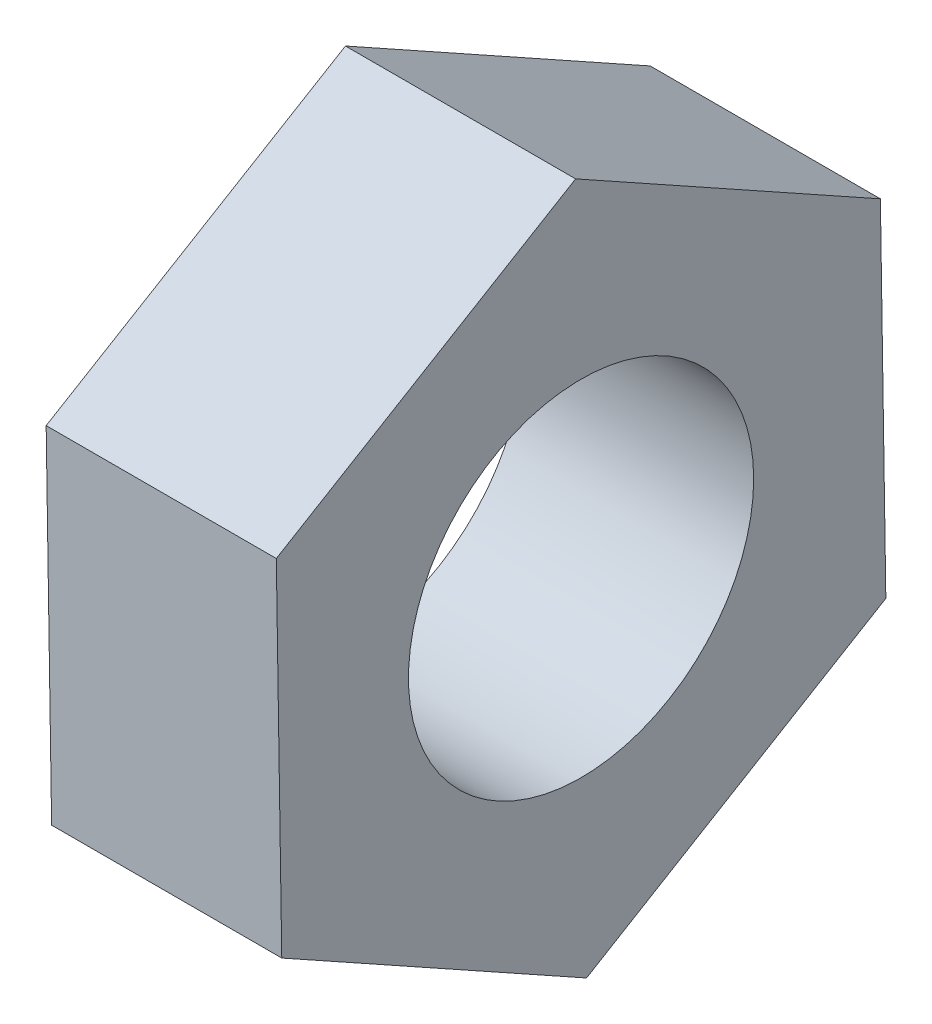
ISO-10303-21;
HEADER;
FILE_DESCRIPTION(('STEP AP214'),'2;1');
FILE_NAME('part.step','',(''),(''),'','','');
FILE_SCHEMA(('AUTOMOTIVE_DESIGN { 1 0 10303 214 1 1 1 1 }'));
ENDSEC;
DATA;
#1=APPLICATION_CONTEXT('core data for automotive mechanical design processes');
#2=APPLICATION_PROTOCOL_DEFINITION('international standard','automotive_design',2000,#1);
#3=PRODUCT_CONTEXT('',#1,'mechanical');
#4=PRODUCT('Part','Part','',(#3));
#5=PRODUCT_RELATED_PRODUCT_CATEGORY('part','',(#4));
#6=PRODUCT_DEFINITION_FORMATION('','',#4);
#7=PRODUCT_DEFINITION_CONTEXT('part definition',#1,'design');
#8=PRODUCT_DEFINITION('design','',#6,#7);
#9=PRODUCT_DEFINITION_SHAPE('','',#8);
#10=(LENGTH_UNIT() NAMED_UNIT(*) SI_UNIT(.MILLI.,.METRE.));
#11=(NAMED_UNIT(*) PLANE_ANGLE_UNIT() SI_UNIT($,.RADIAN.));
#12=(NAMED_UNIT(*) SI_UNIT($,.STERADIAN.) SOLID_ANGLE_UNIT());
#13=UNCERTAINTY_MEASURE_WITH_UNIT(LENGTH_MEASURE(1.E-05),#10,'distance_accuracy_value','');
#14=(GEOMETRIC_REPRESENTATION_CONTEXT(3) GLOBAL_UNCERTAINTY_ASSIGNED_CONTEXT((#13)) GLOBAL_UNIT_ASSIGNED_CONTEXT((#10,
#11,#12)) REPRESENTATION_CONTEXT('',''));
#15=CARTESIAN_POINT('',(0.,0.,0.));
#16=DIRECTION('',(0.,0.,1.));
#17=DIRECTION('',(1.,0.,0.));
#18=AXIS2_PLACEMENT_3D('',#15,#16,#17);
#19=CARTESIAN_POINT('',(8.,0.,0.));
#20=DIRECTION('',(1.,0.,0.));
#21=DIRECTION('',(0.,0.,-1.));
#22=AXIS2_PLACEMENT_3D('',#19,#20,#21);
#23=PLANE('',#22);
#24=DIRECTION('',(0.,0.513492900870808,-0.858093841462158));
#25=VECTOR('',#24,1.);
#26=CARTESIAN_POINT('',(8.,-12.1228706130722,-0.189758000383048));
#27=LINE('',#26,#25);
#28=CARTESIAN_POINT('',(8.,-12.1228706130722,-0.189758000383048));
#29=VERTEX_POINT('',#28);
#30=CARTESIAN_POINT('',(8.,-5.89710005763306,-10.5935929179039));
#31=VERTEX_POINT('',#30);
#32=EDGE_CURVE('E129',#29,#31,#27,.T.);
#33=ORIENTED_EDGE('',*,*,#32,.T.);
#34=DIRECTION('',(0.,0.999877515972609,0.0156509760860052));
#35=VECTOR('',#34,1.);
#36=CARTESIAN_POINT('',(8.,-5.89710005763306,-10.5935929179039));
#37=LINE('',#36,#35);
#38=CARTESIAN_POINT('',(8.,6.22577055543918,-10.4038349175209));
#39=VERTEX_POINT('',#38);
#40=EDGE_CURVE('E87',#31,#39,#37,.T.);
#41=ORIENTED_EDGE('',*,*,#40,.T.);
#42=DIRECTION('',(0.,0.486384615101801,0.873744817548163));
#43=VECTOR('',#42,1.);
#44=CARTESIAN_POINT('',(8.,6.22577055543918,-10.4038349175209));
#45=LINE('',#44,#43);
#46=CARTESIAN_POINT('',(8.,12.1228706130722,0.189758000383049));
#47=VERTEX_POINT('',#46);
#48=EDGE_CURVE('E100',#39,#47,#45,.T.);
#49=ORIENTED_EDGE('',*,*,#48,.T.);
#50=DIRECTION('',(0.,-0.513492900870808,0.858093841462157));
#51=VECTOR('',#50,1.);
#52=CARTESIAN_POINT('',(8.,12.1228706130722,0.189758000383049));
#53=LINE('',#52,#51);
#54=CARTESIAN_POINT('',(8.,5.89710005763306,10.5935929179039));
#55=VERTEX_POINT('',#54);
#56=EDGE_CURVE('E94',#47,#55,#53,.T.);
#57=ORIENTED_EDGE('',*,*,#56,.T.);
#58=DIRECTION('',(0.,-0.999877515972609,-0.0156509760860057));
#59=VECTOR('',#58,1.);
#60=CARTESIAN_POINT('',(8.,5.89710005763306,10.5935929179039));
#61=LINE('',#60,#59);
#62=CARTESIAN_POINT('',(8.,-6.22577055543918,10.4038349175209));
#63=VERTEX_POINT('',#62);
#64=EDGE_CURVE('E98',#55,#63,#61,.T.);
#65=ORIENTED_EDGE('',*,*,#64,.T.);
#66=DIRECTION('',(0.,-0.486384615101801,-0.873744817548163));
#67=VECTOR('',#66,1.);
#68=CARTESIAN_POINT('',(8.,-6.22577055543918,10.4038349175209));
#69=LINE('',#68,#67);
#70=EDGE_CURVE('E50',#63,#29,#69,.T.);
#71=ORIENTED_EDGE('',*,*,#70,.T.);
#72=EDGE_LOOP('',(#33,#41,#49,#57,#65,#71));
#73=FACE_BOUND('',#72,.T.);
#74=CARTESIAN_POINT('',(8.,0.,0.));
#75=DIRECTION('',(1.,0.,0.));
#76=DIRECTION('',(0.,0.,-1.));
#77=AXIS2_PLACEMENT_3D('',#74,#75,#76);
#78=CIRCLE('',#77,6.);
#79=CARTESIAN_POINT('',(8.,0.,-6.));
#80=VERTEX_POINT('',#79);
#81=EDGE_CURVE('E122',#80,#80,#78,.T.);
#82=ORIENTED_EDGE('',*,*,#81,.F.);
#83=EDGE_LOOP('',(#82));
#84=FACE_BOUND('',#83,.T.);
#85=ADVANCED_FACE('F33',(#73,#84),#23,.T.);
#86=CARTESIAN_POINT('',(0.,0.,0.));
#87=DIRECTION('',(1.,0.,0.));
#88=DIRECTION('',(0.,0.,-1.));
#89=AXIS2_PLACEMENT_3D('',#86,#87,#88);
#90=PLANE('',#89);
#91=DIRECTION('',(0.,0.513492900870808,-0.858093841462158));
#92=VECTOR('',#91,1.);
#93=CARTESIAN_POINT('',(0.,-12.1228706130722,-0.189758000383048));
#94=LINE('',#93,#92);
#95=CARTESIAN_POINT('',(0.,-12.1228706130722,-0.189758000383048));
#96=VERTEX_POINT('',#95);
#97=CARTESIAN_POINT('',(0.,-5.89710005763306,-10.5935929179039));
#98=VERTEX_POINT('',#97);
#99=EDGE_CURVE('E118',#96,#98,#94,.T.);
#100=ORIENTED_EDGE('',*,*,#99,.F.);
#101=DIRECTION('',(0.,-0.486384615101801,-0.873744817548163));
#102=VECTOR('',#101,1.);
#103=CARTESIAN_POINT('',(0.,-6.22577055543918,10.4038349175209));
#104=LINE('',#103,#102);
#105=CARTESIAN_POINT('',(0.,-6.22577055543918,10.4038349175209));
#106=VERTEX_POINT('',#105);
#107=EDGE_CURVE('E79',#106,#96,#104,.T.);
#108=ORIENTED_EDGE('',*,*,#107,.F.);
#109=DIRECTION('',(0.,-0.999877515972609,-0.0156509760860057));
#110=VECTOR('',#109,1.);
#111=CARTESIAN_POINT('',(0.,5.89710005763306,10.5935929179039));
#112=LINE('',#111,#110);
#113=CARTESIAN_POINT('',(0.,5.89710005763306,10.5935929179039));
#114=VERTEX_POINT('',#113);
#115=EDGE_CURVE('E73',#114,#106,#112,.T.);
#116=ORIENTED_EDGE('',*,*,#115,.F.);
#117=DIRECTION('',(0.,-0.513492900870808,0.858093841462157));
#118=VECTOR('',#117,1.);
#119=CARTESIAN_POINT('',(0.,12.1228706130722,0.189758000383049));
#120=LINE('',#119,#118);
#121=CARTESIAN_POINT('',(0.,12.1228706130722,0.189758000383049));
#122=VERTEX_POINT('',#121);
#123=EDGE_CURVE('E108',#122,#114,#120,.T.);
#124=ORIENTED_EDGE('',*,*,#123,.F.);
#125=DIRECTION('',(0.,0.486384615101801,0.873744817548163));
#126=VECTOR('',#125,1.);
#127=CARTESIAN_POINT('',(0.,6.22577055543918,-10.4038349175209));
#128=LINE('',#127,#126);
#129=CARTESIAN_POINT('',(0.,6.22577055543918,-10.4038349175209));
#130=VERTEX_POINT('',#129);
#131=EDGE_CURVE('E124',#130,#122,#128,.T.);
#132=ORIENTED_EDGE('',*,*,#131,.F.);
#133=DIRECTION('',(0.,0.999877515972609,0.0156509760860052));
#134=VECTOR('',#133,1.);
#135=CARTESIAN_POINT('',(0.,-5.89710005763306,-10.5935929179039));
#136=LINE('',#135,#134);
#137=EDGE_CURVE('E121',#98,#130,#136,.T.);
#138=ORIENTED_EDGE('',*,*,#137,.F.);
#139=EDGE_LOOP('',(#100,#108,#116,#124,#132,#138));
#140=FACE_BOUND('',#139,.T.);
#141=CARTESIAN_POINT('',(0.,0.,0.));
#142=DIRECTION('',(1.,0.,0.));
#143=DIRECTION('',(0.,0.,-1.));
#144=AXIS2_PLACEMENT_3D('',#141,#142,#143);
#145=CIRCLE('',#144,6.);
#146=CARTESIAN_POINT('',(0.,0.,-6.));
#147=VERTEX_POINT('',#146);
#148=EDGE_CURVE('E222',#147,#147,#145,.T.);
#149=ORIENTED_EDGE('',*,*,#148,.T.);
#150=EDGE_LOOP('',(#149));
#151=FACE_BOUND('',#150,.T.);
#152=ADVANCED_FACE('F138',(#140,#151),#90,.F.);
#153=CARTESIAN_POINT('',(8.,-12.1228706130722,-0.189758000383048));
#154=DIRECTION('',(0.,0.858093841462158,0.513492900870808));
#155=DIRECTION('',(0.,-0.513492900870808,0.858093841462158));
#156=AXIS2_PLACEMENT_3D('',#153,#154,#155);
#157=PLANE('',#156);
#158=ORIENTED_EDGE('',*,*,#99,.T.);
#159=DIRECTION('',(-1.,0.,0.));
#160=VECTOR('',#159,1.);
#161=CARTESIAN_POINT('',(8.,-5.89710005763306,-10.5935929179039));
#162=LINE('',#161,#160);
#163=EDGE_CURVE('E11',#31,#98,#162,.T.);
#164=ORIENTED_EDGE('',*,*,#163,.F.);
#165=ORIENTED_EDGE('',*,*,#32,.F.);
#166=DIRECTION('',(-1.,0.,0.));
#167=VECTOR('',#166,1.);
#168=CARTESIAN_POINT('',(8.,-12.1228706130722,-0.189758000383048));
#169=LINE('',#168,#167);
#170=EDGE_CURVE('E114',#29,#96,#169,.T.);
#171=ORIENTED_EDGE('',*,*,#170,.T.);
#172=EDGE_LOOP('',(#158,#164,#165,#171));
#173=FACE_BOUND('',#172,.T.);
#174=ADVANCED_FACE('F35',(#173),#157,.F.);
#175=CARTESIAN_POINT('',(8.,-5.89710005763306,-10.5935929179039));
#176=DIRECTION('',(0.,-0.0156509760860052,0.999877515972609));
#177=DIRECTION('',(0.,-0.999877515972609,-0.0156509760860052));
#178=AXIS2_PLACEMENT_3D('',#175,#176,#177);
#179=PLANE('',#178);
#180=ORIENTED_EDGE('',*,*,#137,.T.);
#181=DIRECTION('',(-1.,0.,0.));
#182=VECTOR('',#181,1.);
#183=CARTESIAN_POINT('',(8.,6.22577055543918,-10.4038349175209));
#184=LINE('',#183,#182);
#185=EDGE_CURVE('E42',#39,#130,#184,.T.);
#186=ORIENTED_EDGE('',*,*,#185,.F.);
#187=ORIENTED_EDGE('',*,*,#40,.F.);
#188=ORIENTED_EDGE('',*,*,#163,.T.);
#189=EDGE_LOOP('',(#180,#186,#187,#188));
#190=FACE_BOUND('',#189,.T.);
#191=ADVANCED_FACE('F163',(#190),#179,.F.);
#192=CARTESIAN_POINT('',(8.,6.22577055543918,-10.4038349175209));
#193=DIRECTION('',(0.,-0.873744817548163,0.486384615101801));
#194=DIRECTION('',(0.,-0.486384615101801,-0.873744817548163));
#195=AXIS2_PLACEMENT_3D('',#192,#193,#194);
#196=PLANE('',#195);
#197=ORIENTED_EDGE('',*,*,#131,.T.);
#198=DIRECTION('',(-1.,0.,0.));
#199=VECTOR('',#198,1.);
#200=CARTESIAN_POINT('',(8.,12.1228706130722,0.189758000383049));
#201=LINE('',#200,#199);
#202=EDGE_CURVE('E109',#47,#122,#201,.T.);
#203=ORIENTED_EDGE('',*,*,#202,.F.);
#204=ORIENTED_EDGE('',*,*,#48,.F.);
#205=ORIENTED_EDGE('',*,*,#185,.T.);
#206=EDGE_LOOP('',(#197,#203,#204,#205));
#207=FACE_BOUND('',#206,.T.);
#208=ADVANCED_FACE('F135',(#207),#196,.F.);
#209=CARTESIAN_POINT('',(8.,12.1228706130722,0.189758000383049));
#210=DIRECTION('',(0.,-0.858093841462158,-0.513492900870808));
#211=DIRECTION('',(0.,0.513492900870808,-0.858093841462158));
#212=AXIS2_PLACEMENT_3D('',#209,#210,#211);
#213=PLANE('',#212);
#214=ORIENTED_EDGE('',*,*,#123,.T.);
#215=DIRECTION('',(-1.,0.,0.));
#216=VECTOR('',#215,1.);
#217=CARTESIAN_POINT('',(8.,5.89710005763306,10.5935929179039));
#218=LINE('',#217,#216);
#219=EDGE_CURVE('E105',#55,#114,#218,.T.);
#220=ORIENTED_EDGE('',*,*,#219,.F.);
#221=ORIENTED_EDGE('',*,*,#56,.F.);
#222=ORIENTED_EDGE('',*,*,#202,.T.);
#223=EDGE_LOOP('',(#214,#220,#221,#222));
#224=FACE_BOUND('',#223,.T.);
#225=ADVANCED_FACE('F106',(#224),#213,.F.);
#226=CARTESIAN_POINT('',(8.,5.89710005763306,10.5935929179039));
#227=DIRECTION('',(0.,0.0156509760860057,-0.999877515972609));
#228=DIRECTION('',(0.,0.999877515972609,0.0156509760860057));
#229=AXIS2_PLACEMENT_3D('',#226,#227,#228);
#230=PLANE('',#229);
#231=ORIENTED_EDGE('',*,*,#115,.T.);
#232=DIRECTION('',(-1.,0.,0.));
#233=VECTOR('',#232,1.);
#234=CARTESIAN_POINT('',(8.,-6.22577055543918,10.4038349175209));
#235=LINE('',#234,#233);
#236=EDGE_CURVE('E110',#63,#106,#235,.T.);
#237=ORIENTED_EDGE('',*,*,#236,.F.);
#238=ORIENTED_EDGE('',*,*,#64,.F.);
#239=ORIENTED_EDGE('',*,*,#219,.T.);
#240=EDGE_LOOP('',(#231,#237,#238,#239));
#241=FACE_BOUND('',#240,.T.);
#242=ADVANCED_FACE('F112',(#241),#230,.F.);
#243=CARTESIAN_POINT('',(8.,-6.22577055543918,10.4038349175209));
#244=DIRECTION('',(0.,0.873744817548163,-0.486384615101801));
#245=DIRECTION('',(0.,0.486384615101801,0.873744817548163));
#246=AXIS2_PLACEMENT_3D('',#243,#244,#245);
#247=PLANE('',#246);
#248=ORIENTED_EDGE('',*,*,#107,.T.);
#249=ORIENTED_EDGE('',*,*,#170,.F.);
#250=ORIENTED_EDGE('',*,*,#70,.F.);
#251=ORIENTED_EDGE('',*,*,#236,.T.);
#252=EDGE_LOOP('',(#248,#249,#250,#251));
#253=FACE_BOUND('',#252,.T.);
#254=ADVANCED_FACE('F143',(#253),#247,.F.);
#255=CARTESIAN_POINT('',(8.,0.,0.));
#256=DIRECTION('',(-1.,0.,0.));
#257=DIRECTION('',(0.,0.,1.));
#258=AXIS2_PLACEMENT_3D('',#255,#256,#257);
#259=CYLINDRICAL_SURFACE('',#258,6.);
#260=ORIENTED_EDGE('',*,*,#81,.T.);
#261=EDGE_LOOP('',(#260));
#262=FACE_BOUND('',#261,.T.);
#263=ORIENTED_EDGE('',*,*,#148,.F.);
#264=EDGE_LOOP('',(#263));
#265=FACE_BOUND('',#264,.T.);
#266=ADVANCED_FACE('F145',(#262,#265),#259,.F.);
#267=CLOSED_SHELL('',(#85,#152,#174,#191,#208,#225,#242,#254,#266));
#268=MANIFOLD_SOLID_BREP('B2',#267);
#269=ADVANCED_BREP_SHAPE_REPRESENTATION('',(#18,#268),#14);
#270=SHAPE_DEFINITION_REPRESENTATION(#9,#269);
ENDSEC;
END-ISO-10303-21;
